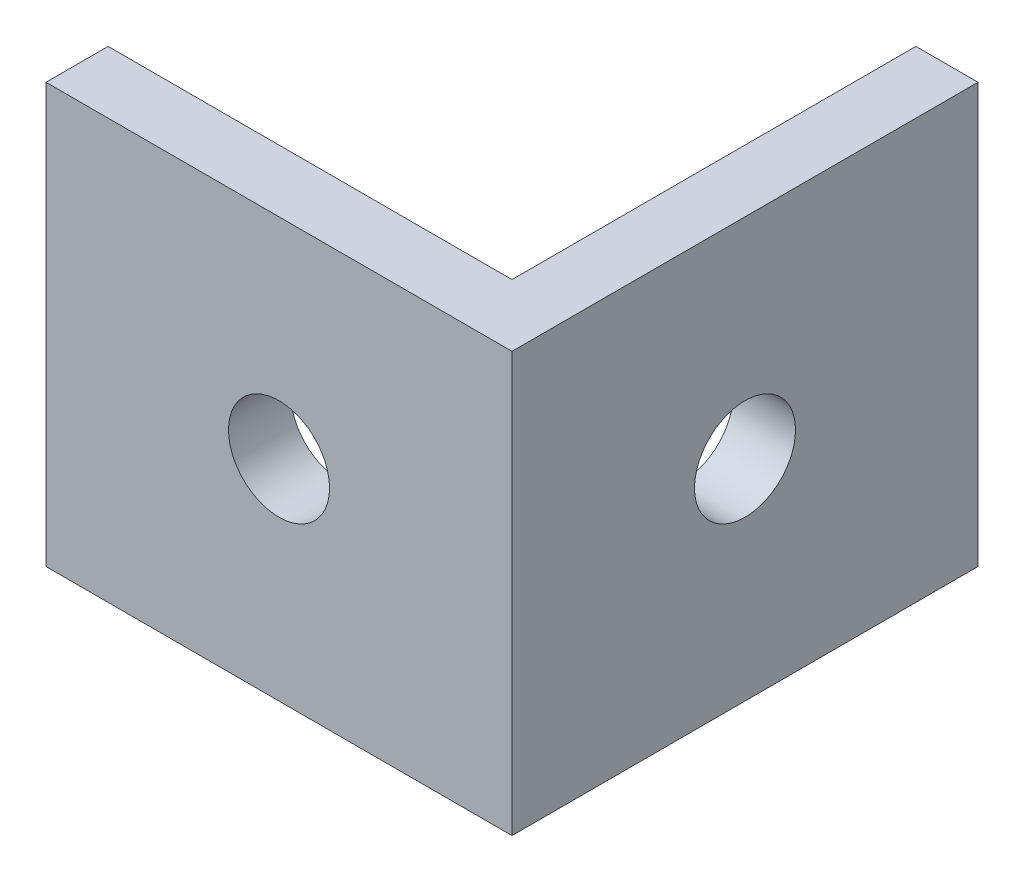
ISO-10303-21;
HEADER;
FILE_DESCRIPTION(('STEP AP214'),'2;1');
FILE_NAME('part.step','',(''),(''),'','','');
FILE_SCHEMA(('AUTOMOTIVE_DESIGN { 1 0 10303 214 1 1 1 1 }'));
ENDSEC;
DATA;
#1=APPLICATION_CONTEXT('core data for automotive mechanical design processes');
#2=APPLICATION_PROTOCOL_DEFINITION('international standard','automotive_design',2000,#1);
#3=PRODUCT_CONTEXT('',#1,'mechanical');
#4=PRODUCT('Part','Part','',(#3));
#5=PRODUCT_RELATED_PRODUCT_CATEGORY('part','',(#4));
#6=PRODUCT_DEFINITION_FORMATION('','',#4);
#7=PRODUCT_DEFINITION_CONTEXT('part definition',#1,'design');
#8=PRODUCT_DEFINITION('design','',#6,#7);
#9=PRODUCT_DEFINITION_SHAPE('','',#8);
#10=(LENGTH_UNIT() NAMED_UNIT(*) SI_UNIT(.MILLI.,.METRE.));
#11=(NAMED_UNIT(*) PLANE_ANGLE_UNIT() SI_UNIT($,.RADIAN.));
#12=(NAMED_UNIT(*) SI_UNIT($,.STERADIAN.) SOLID_ANGLE_UNIT());
#13=UNCERTAINTY_MEASURE_WITH_UNIT(LENGTH_MEASURE(1.E-05),#10,'distance_accuracy_value','');
#14=(GEOMETRIC_REPRESENTATION_CONTEXT(3) GLOBAL_UNCERTAINTY_ASSIGNED_CONTEXT((#13)) GLOBAL_UNIT_ASSIGNED_CONTEXT((#10,
#11,#12)) REPRESENTATION_CONTEXT('',''));
#15=CARTESIAN_POINT('',(0.,0.,0.));
#16=DIRECTION('',(0.,0.,1.));
#17=DIRECTION('',(1.,0.,0.));
#18=AXIS2_PLACEMENT_3D('',#15,#16,#17);
#19=CARTESIAN_POINT('',(-30.,27.,0.));
#20=DIRECTION('',(0.,0.,-1.));
#21=DIRECTION('',(-1.,0.,0.));
#22=AXIS2_PLACEMENT_3D('',#19,#20,#21);
#23=PLANE('',#22);
#24=CARTESIAN_POINT('',(-15.,13.5,0.));
#25=DIRECTION('',(0.,0.,-1.));
#26=DIRECTION('',(-1.,0.,0.));
#27=AXIS2_PLACEMENT_3D('',#24,#25,#26);
#28=CIRCLE('',#27,3.25);
#29=CARTESIAN_POINT('',(-18.25,13.5,0.));
#30=VERTEX_POINT('',#29);
#31=EDGE_CURVE('E130',#30,#30,#28,.T.);
#32=ORIENTED_EDGE('',*,*,#31,.T.);
#33=EDGE_LOOP('',(#32));
#34=FACE_BOUND('',#33,.T.);
#35=DIRECTION('',(1.,0.,0.));
#36=VECTOR('',#35,1.);
#37=CARTESIAN_POINT('',(-30.,0.,0.));
#38=LINE('',#37,#36);
#39=CARTESIAN_POINT('',(-30.,0.,0.));
#40=VERTEX_POINT('',#39);
#41=CARTESIAN_POINT('',(0.,0.,0.));
#42=VERTEX_POINT('',#41);
#43=EDGE_CURVE('E126',#40,#42,#38,.T.);
#44=ORIENTED_EDGE('',*,*,#43,.T.);
#45=DIRECTION('',(0.,-1.,0.));
#46=VECTOR('',#45,1.);
#47=CARTESIAN_POINT('',(0.,27.,0.));
#48=LINE('',#47,#46);
#49=CARTESIAN_POINT('',(0.,27.,0.));
#50=VERTEX_POINT('',#49);
#51=EDGE_CURVE('E11',#50,#42,#48,.T.);
#52=ORIENTED_EDGE('',*,*,#51,.F.);
#53=DIRECTION('',(1.,0.,0.));
#54=VECTOR('',#53,1.);
#55=CARTESIAN_POINT('',(-30.,27.,0.));
#56=LINE('',#55,#54);
#57=CARTESIAN_POINT('',(-30.,27.,0.));
#58=VERTEX_POINT('',#57);
#59=EDGE_CURVE('E137',#58,#50,#56,.T.);
#60=ORIENTED_EDGE('',*,*,#59,.F.);
#61=DIRECTION('',(0.,-1.,0.));
#62=VECTOR('',#61,1.);
#63=CARTESIAN_POINT('',(-30.,27.,0.));
#64=LINE('',#63,#62);
#65=EDGE_CURVE('E122',#58,#40,#64,.T.);
#66=ORIENTED_EDGE('',*,*,#65,.T.);
#67=EDGE_LOOP('',(#44,#52,#60,#66));
#68=FACE_BOUND('',#67,.T.);
#69=ADVANCED_FACE('F41',(#34,#68),#23,.F.);
#70=CARTESIAN_POINT('',(0.,27.,0.));
#71=DIRECTION('',(-1.,0.,0.));
#72=DIRECTION('',(0.,0.,1.));
#73=AXIS2_PLACEMENT_3D('',#70,#71,#72);
#74=PLANE('',#73);
#75=CARTESIAN_POINT('',(0.,13.5,-15.));
#76=DIRECTION('',(1.,0.,0.));
#77=DIRECTION('',(0.,0.,-1.));
#78=AXIS2_PLACEMENT_3D('',#75,#76,#77);
#79=CIRCLE('',#78,3.25);
#80=CARTESIAN_POINT('',(0.,13.5,-18.25));
#81=VERTEX_POINT('',#80);
#82=EDGE_CURVE('E181',#81,#81,#79,.T.);
#83=ORIENTED_EDGE('',*,*,#82,.F.);
#84=EDGE_LOOP('',(#83));
#85=FACE_BOUND('',#84,.T.);
#86=DIRECTION('',(0.,0.,-1.));
#87=VECTOR('',#86,1.);
#88=CARTESIAN_POINT('',(0.,0.,0.));
#89=LINE('',#88,#87);
#90=CARTESIAN_POINT('',(0.,0.,-30.));
#91=VERTEX_POINT('',#90);
#92=EDGE_CURVE('E129',#42,#91,#89,.T.);
#93=ORIENTED_EDGE('',*,*,#92,.T.);
#94=DIRECTION('',(0.,-1.,0.));
#95=VECTOR('',#94,1.);
#96=CARTESIAN_POINT('',(0.,27.,-30.));
#97=LINE('',#96,#95);
#98=CARTESIAN_POINT('',(0.,27.,-30.));
#99=VERTEX_POINT('',#98);
#100=EDGE_CURVE('E50',#99,#91,#97,.T.);
#101=ORIENTED_EDGE('',*,*,#100,.F.);
#102=DIRECTION('',(0.,0.,-1.));
#103=VECTOR('',#102,1.);
#104=CARTESIAN_POINT('',(0.,27.,0.));
#105=LINE('',#104,#103);
#106=EDGE_CURVE('E95',#50,#99,#105,.T.);
#107=ORIENTED_EDGE('',*,*,#106,.F.);
#108=ORIENTED_EDGE('',*,*,#51,.T.);
#109=EDGE_LOOP('',(#93,#101,#107,#108));
#110=FACE_BOUND('',#109,.T.);
#111=ADVANCED_FACE('F164',(#85,#110),#74,.F.);
#112=CARTESIAN_POINT('',(0.,27.,-30.));
#113=DIRECTION('',(0.,0.,1.));
#114=DIRECTION('',(1.,0.,0.));
#115=AXIS2_PLACEMENT_3D('',#112,#113,#114);
#116=PLANE('',#115);
#117=DIRECTION('',(-1.,0.,0.));
#118=VECTOR('',#117,1.);
#119=CARTESIAN_POINT('',(0.,0.,-30.));
#120=LINE('',#119,#118);
#121=CARTESIAN_POINT('',(-4.,0.,-30.));
#122=VERTEX_POINT('',#121);
#123=EDGE_CURVE('E132',#91,#122,#120,.T.);
#124=ORIENTED_EDGE('',*,*,#123,.T.);
#125=DIRECTION('',(0.,-1.,0.));
#126=VECTOR('',#125,1.);
#127=CARTESIAN_POINT('',(-4.,27.,-30.));
#128=LINE('',#127,#126);
#129=CARTESIAN_POINT('',(-4.,27.,-30.));
#130=VERTEX_POINT('',#129);
#131=EDGE_CURVE('E117',#130,#122,#128,.T.);
#132=ORIENTED_EDGE('',*,*,#131,.F.);
#133=DIRECTION('',(-1.,0.,0.));
#134=VECTOR('',#133,1.);
#135=CARTESIAN_POINT('',(0.,27.,-30.));
#136=LINE('',#135,#134);
#137=EDGE_CURVE('E108',#99,#130,#136,.T.);
#138=ORIENTED_EDGE('',*,*,#137,.F.);
#139=ORIENTED_EDGE('',*,*,#100,.T.);
#140=EDGE_LOOP('',(#124,#132,#138,#139));
#141=FACE_BOUND('',#140,.T.);
#142=ADVANCED_FACE('F144',(#141),#116,.F.);
#143=CARTESIAN_POINT('',(-4.,27.,-30.));
#144=DIRECTION('',(1.,0.,0.));
#145=DIRECTION('',(0.,0.,-1.));
#146=AXIS2_PLACEMENT_3D('',#143,#144,#145);
#147=PLANE('',#146);
#148=CARTESIAN_POINT('',(-4.,13.5,-15.));
#149=DIRECTION('',(1.,0.,0.));
#150=DIRECTION('',(0.,0.,-1.));
#151=AXIS2_PLACEMENT_3D('',#148,#149,#150);
#152=CIRCLE('',#151,3.25);
#153=CARTESIAN_POINT('',(-4.,13.5,-18.25));
#154=VERTEX_POINT('',#153);
#155=EDGE_CURVE('E44',#154,#154,#152,.T.);
#156=ORIENTED_EDGE('',*,*,#155,.T.);
#157=EDGE_LOOP('',(#156));
#158=FACE_BOUND('',#157,.T.);
#159=DIRECTION('',(0.,0.,1.));
#160=VECTOR('',#159,1.);
#161=CARTESIAN_POINT('',(-4.,0.,-30.));
#162=LINE('',#161,#160);
#163=CARTESIAN_POINT('',(-4.,0.,-4.));
#164=VERTEX_POINT('',#163);
#165=EDGE_CURVE('E116',#122,#164,#162,.T.);
#166=ORIENTED_EDGE('',*,*,#165,.T.);
#167=DIRECTION('',(0.,-1.,0.));
#168=VECTOR('',#167,1.);
#169=CARTESIAN_POINT('',(-4.,27.,-4.));
#170=LINE('',#169,#168);
#171=CARTESIAN_POINT('',(-4.,27.,-4.));
#172=VERTEX_POINT('',#171);
#173=EDGE_CURVE('E113',#172,#164,#170,.T.);
#174=ORIENTED_EDGE('',*,*,#173,.F.);
#175=DIRECTION('',(0.,0.,1.));
#176=VECTOR('',#175,1.);
#177=CARTESIAN_POINT('',(-4.,27.,-30.));
#178=LINE('',#177,#176);
#179=EDGE_CURVE('E102',#130,#172,#178,.T.);
#180=ORIENTED_EDGE('',*,*,#179,.F.);
#181=ORIENTED_EDGE('',*,*,#131,.T.);
#182=EDGE_LOOP('',(#166,#174,#180,#181));
#183=FACE_BOUND('',#182,.T.);
#184=ADVANCED_FACE('F114',(#158,#183),#147,.F.);
#185=CARTESIAN_POINT('',(-4.,27.,-4.));
#186=DIRECTION('',(0.,0.,1.));
#187=DIRECTION('',(1.,0.,0.));
#188=AXIS2_PLACEMENT_3D('',#185,#186,#187);
#189=PLANE('',#188);
#190=CARTESIAN_POINT('',(-15.,13.5,-4.));
#191=DIRECTION('',(0.,0.,-1.));
#192=DIRECTION('',(-1.,0.,0.));
#193=AXIS2_PLACEMENT_3D('',#190,#191,#192);
#194=CIRCLE('',#193,3.25);
#195=CARTESIAN_POINT('',(-18.25,13.5,-4.));
#196=VERTEX_POINT('',#195);
#197=EDGE_CURVE('E174',#196,#196,#194,.T.);
#198=ORIENTED_EDGE('',*,*,#197,.F.);
#199=EDGE_LOOP('',(#198));
#200=FACE_BOUND('',#199,.T.);
#201=DIRECTION('',(-1.,0.,0.));
#202=VECTOR('',#201,1.);
#203=CARTESIAN_POINT('',(-4.,0.,-4.));
#204=LINE('',#203,#202);
#205=CARTESIAN_POINT('',(-30.,0.,-4.));
#206=VERTEX_POINT('',#205);
#207=EDGE_CURVE('E81',#164,#206,#204,.T.);
#208=ORIENTED_EDGE('',*,*,#207,.T.);
#209=DIRECTION('',(0.,-1.,0.));
#210=VECTOR('',#209,1.);
#211=CARTESIAN_POINT('',(-30.,27.,-4.));
#212=LINE('',#211,#210);
#213=CARTESIAN_POINT('',(-30.,27.,-4.));
#214=VERTEX_POINT('',#213);
#215=EDGE_CURVE('E118',#214,#206,#212,.T.);
#216=ORIENTED_EDGE('',*,*,#215,.F.);
#217=DIRECTION('',(-1.,0.,0.));
#218=VECTOR('',#217,1.);
#219=CARTESIAN_POINT('',(-4.,27.,-4.));
#220=LINE('',#219,#218);
#221=EDGE_CURVE('E106',#172,#214,#220,.T.);
#222=ORIENTED_EDGE('',*,*,#221,.F.);
#223=ORIENTED_EDGE('',*,*,#173,.T.);
#224=EDGE_LOOP('',(#208,#216,#222,#223));
#225=FACE_BOUND('',#224,.T.);
#226=ADVANCED_FACE('F120',(#200,#225),#189,.F.);
#227=CARTESIAN_POINT('',(-30.,27.,-4.));
#228=DIRECTION('',(1.,0.,0.));
#229=DIRECTION('',(0.,0.,-1.));
#230=AXIS2_PLACEMENT_3D('',#227,#228,#229);
#231=PLANE('',#230);
#232=DIRECTION('',(0.,0.,1.));
#233=VECTOR('',#232,1.);
#234=CARTESIAN_POINT('',(-30.,0.,-4.));
#235=LINE('',#234,#233);
#236=EDGE_CURVE('E87',#206,#40,#235,.T.);
#237=ORIENTED_EDGE('',*,*,#236,.T.);
#238=ORIENTED_EDGE('',*,*,#65,.F.);
#239=DIRECTION('',(0.,0.,1.));
#240=VECTOR('',#239,1.);
#241=CARTESIAN_POINT('',(-30.,27.,-4.));
#242=LINE('',#241,#240);
#243=EDGE_CURVE('E58',#214,#58,#242,.T.);
#244=ORIENTED_EDGE('',*,*,#243,.F.);
#245=ORIENTED_EDGE('',*,*,#215,.T.);
#246=EDGE_LOOP('',(#237,#238,#244,#245));
#247=FACE_BOUND('',#246,.T.);
#248=ADVANCED_FACE('F151',(#247),#231,.F.);
#249=CARTESIAN_POINT('',(0.,27.,0.));
#250=DIRECTION('',(0.,1.,0.));
#251=DIRECTION('',(0.,0.,1.));
#252=AXIS2_PLACEMENT_3D('',#249,#250,#251);
#253=PLANE('',#252);
#254=ORIENTED_EDGE('',*,*,#59,.T.);
#255=ORIENTED_EDGE('',*,*,#106,.T.);
#256=ORIENTED_EDGE('',*,*,#137,.T.);
#257=ORIENTED_EDGE('',*,*,#179,.T.);
#258=ORIENTED_EDGE('',*,*,#221,.T.);
#259=ORIENTED_EDGE('',*,*,#243,.T.);
#260=EDGE_LOOP('',(#254,#255,#256,#257,#258,#259));
#261=FACE_BOUND('',#260,.T.);
#262=ADVANCED_FACE('F104',(#261),#253,.T.);
#263=CARTESIAN_POINT('',(0.,0.,0.));
#264=DIRECTION('',(0.,1.,0.));
#265=DIRECTION('',(0.,0.,1.));
#266=AXIS2_PLACEMENT_3D('',#263,#264,#265);
#267=PLANE('',#266);
#268=ORIENTED_EDGE('',*,*,#43,.F.);
#269=ORIENTED_EDGE('',*,*,#236,.F.);
#270=ORIENTED_EDGE('',*,*,#207,.F.);
#271=ORIENTED_EDGE('',*,*,#165,.F.);
#272=ORIENTED_EDGE('',*,*,#123,.F.);
#273=ORIENTED_EDGE('',*,*,#92,.F.);
#274=EDGE_LOOP('',(#268,#269,#270,#271,#272,#273));
#275=FACE_BOUND('',#274,.T.);
#276=ADVANCED_FACE('F147',(#275),#267,.F.);
#277=CARTESIAN_POINT('',(-15.,13.5,23.));
#278=DIRECTION('',(0.,0.,-1.));
#279=DIRECTION('',(-1.,0.,0.));
#280=AXIS2_PLACEMENT_3D('',#277,#278,#279);
#281=CYLINDRICAL_SURFACE('',#280,3.25);
#282=ORIENTED_EDGE('',*,*,#197,.T.);
#283=EDGE_LOOP('',(#282));
#284=FACE_BOUND('',#283,.T.);
#285=ORIENTED_EDGE('',*,*,#31,.F.);
#286=EDGE_LOOP('',(#285));
#287=FACE_BOUND('',#286,.T.);
#288=ADVANCED_FACE('F191',(#284,#287),#281,.F.);
#289=CARTESIAN_POINT('',(-27.,13.5,-15.));
#290=DIRECTION('',(1.,0.,0.));
#291=DIRECTION('',(0.,0.,-1.));
#292=AXIS2_PLACEMENT_3D('',#289,#290,#291);
#293=CYLINDRICAL_SURFACE('',#292,3.25);
#294=ORIENTED_EDGE('',*,*,#82,.T.);
#295=EDGE_LOOP('',(#294));
#296=FACE_BOUND('',#295,.T.);
#297=ORIENTED_EDGE('',*,*,#155,.F.);
#298=EDGE_LOOP('',(#297));
#299=FACE_BOUND('',#298,.T.);
#300=ADVANCED_FACE('F189',(#296,#299),#293,.F.);
#301=CLOSED_SHELL('',(#69,#111,#142,#184,#226,#248,#262,#276,#288,#300));
#302=MANIFOLD_SOLID_BREP('B2',#301);
#303=ADVANCED_BREP_SHAPE_REPRESENTATION('',(#18,#302),#14);
#304=SHAPE_DEFINITION_REPRESENTATION(#9,#303);
ENDSEC;
END-ISO-10303-21;
